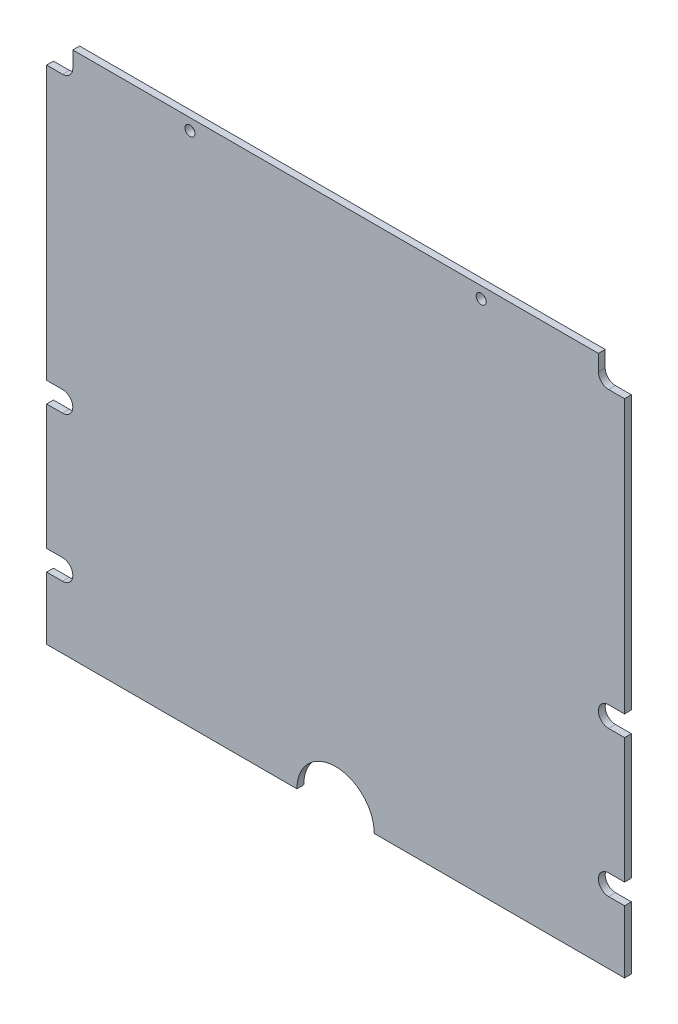
ISO-10303-21;
HEADER;
FILE_DESCRIPTION(('STEP AP214'),'2;1');
FILE_NAME('part.step','',(''),(''),'','','');
FILE_SCHEMA(('AUTOMOTIVE_DESIGN { 1 0 10303 214 1 1 1 1 }'));
ENDSEC;
DATA;
#1=APPLICATION_CONTEXT('core data for automotive mechanical design processes');
#2=APPLICATION_PROTOCOL_DEFINITION('international standard','automotive_design',2000,#1);
#3=PRODUCT_CONTEXT('',#1,'mechanical');
#4=PRODUCT('Part','Part','',(#3));
#5=PRODUCT_RELATED_PRODUCT_CATEGORY('part','',(#4));
#6=PRODUCT_DEFINITION_FORMATION('','',#4);
#7=PRODUCT_DEFINITION_CONTEXT('part definition',#1,'design');
#8=PRODUCT_DEFINITION('design','',#6,#7);
#9=PRODUCT_DEFINITION_SHAPE('','',#8);
#10=(LENGTH_UNIT() NAMED_UNIT(*) SI_UNIT(.MILLI.,.METRE.));
#11=(NAMED_UNIT(*) PLANE_ANGLE_UNIT() SI_UNIT($,.RADIAN.));
#12=(NAMED_UNIT(*) SI_UNIT($,.STERADIAN.) SOLID_ANGLE_UNIT());
#13=UNCERTAINTY_MEASURE_WITH_UNIT(LENGTH_MEASURE(1.E-05),#10,'distance_accuracy_value','');
#14=(GEOMETRIC_REPRESENTATION_CONTEXT(3) GLOBAL_UNCERTAINTY_ASSIGNED_CONTEXT((#13)) GLOBAL_UNIT_ASSIGNED_CONTEXT((#10,
#11,#12)) REPRESENTATION_CONTEXT('',''));
#15=CARTESIAN_POINT('',(0.,0.,0.));
#16=DIRECTION('',(0.,0.,1.));
#17=DIRECTION('',(1.,0.,0.));
#18=AXIS2_PLACEMENT_3D('',#15,#16,#17);
#19=CARTESIAN_POINT('',(-120.,61.,0.));
#20=DIRECTION('',(0.,0.,-1.));
#21=DIRECTION('',(1.,0.,0.));
#22=AXIS2_PLACEMENT_3D('',#19,#20,#21);
#23=CYLINDRICAL_SURFACE('',#22,4.5);
#24=DIRECTION('',(0.,0.,1.));
#25=VECTOR('',#24,1.);
#26=CARTESIAN_POINT('',(-120.000000000003,56.5000000000793,0.));
#27=LINE('',#26,#25);
#28=CARTESIAN_POINT('',(-120.,56.5,0.));
#29=VERTEX_POINT('',#28);
#30=CARTESIAN_POINT('',(-120.,56.5,3.));
#31=VERTEX_POINT('',#30);
#32=EDGE_CURVE('E379',#29,#31,#27,.T.);
#33=ORIENTED_EDGE('',*,*,#32,.T.);
#34=CARTESIAN_POINT('',(-120.,61.,3.));
#35=DIRECTION('',(0.,0.,1.));
#36=DIRECTION('',(1.,0.,0.));
#37=AXIS2_PLACEMENT_3D('',#34,#35,#36);
#38=CIRCLE('',#37,4.5);
#39=CARTESIAN_POINT('',(-115.5,61.000000000001,3.));
#40=VERTEX_POINT('',#39);
#41=EDGE_CURVE('E293',#31,#40,#38,.T.);
#42=ORIENTED_EDGE('',*,*,#41,.T.);
#43=DIRECTION('',(0.,0.,1.));
#44=VECTOR('',#43,1.);
#45=CARTESIAN_POINT('',(-115.5,61.000000000001,0.));
#46=LINE('',#45,#44);
#47=CARTESIAN_POINT('',(-115.5,61.000000000001,0.));
#48=VERTEX_POINT('',#47);
#49=EDGE_CURVE('E11',#48,#40,#46,.T.);
#50=ORIENTED_EDGE('',*,*,#49,.F.);
#51=CARTESIAN_POINT('',(-120.,61.,0.));
#52=DIRECTION('',(0.,0.,1.));
#53=DIRECTION('',(1.,0.,0.));
#54=AXIS2_PLACEMENT_3D('',#51,#52,#53);
#55=CIRCLE('',#54,4.5);
#56=EDGE_CURVE('E300',#29,#48,#55,.T.);
#57=ORIENTED_EDGE('',*,*,#56,.F.);
#58=EDGE_LOOP('',(#33,#42,#50,#57));
#59=FACE_BOUND('',#58,.T.);
#60=ADVANCED_FACE('F17',(#59),#23,.F.);
#61=CARTESIAN_POINT('',(-115.5,61.000000000001,0.));
#62=DIRECTION('',(-1.,0.,0.));
#63=DIRECTION('',(0.,0.,1.));
#64=AXIS2_PLACEMENT_3D('',#61,#62,#63);
#65=PLANE('',#64);
#66=ORIENTED_EDGE('',*,*,#49,.T.);
#67=DIRECTION('',(0.,1.,0.));
#68=VECTOR('',#67,1.);
#69=CARTESIAN_POINT('',(-115.5,61.000000000001,3.));
#70=LINE('',#69,#68);
#71=CARTESIAN_POINT('',(-115.5,68.,3.));
#72=VERTEX_POINT('',#71);
#73=EDGE_CURVE('E289',#40,#72,#70,.T.);
#74=ORIENTED_EDGE('',*,*,#73,.T.);
#75=DIRECTION('',(0.,0.,1.));
#76=VECTOR('',#75,1.);
#77=CARTESIAN_POINT('',(-115.5,68.,0.));
#78=LINE('',#77,#76);
#79=CARTESIAN_POINT('',(-115.5,68.,0.));
#80=VERTEX_POINT('',#79);
#81=EDGE_CURVE('E26',#80,#72,#78,.T.);
#82=ORIENTED_EDGE('',*,*,#81,.F.);
#83=DIRECTION('',(0.,1.,0.));
#84=VECTOR('',#83,1.);
#85=CARTESIAN_POINT('',(-115.5,61.000000000001,0.));
#86=LINE('',#85,#84);
#87=EDGE_CURVE('E314',#48,#80,#86,.T.);
#88=ORIENTED_EDGE('',*,*,#87,.F.);
#89=EDGE_LOOP('',(#66,#74,#82,#88));
#90=FACE_BOUND('',#89,.T.);
#91=ADVANCED_FACE('F470',(#90),#65,.T.);
#92=CARTESIAN_POINT('',(-115.5,68.,0.));
#93=DIRECTION('',(0.,1.,0.));
#94=DIRECTION('',(1.,0.,0.));
#95=AXIS2_PLACEMENT_3D('',#92,#93,#94);
#96=PLANE('',#95);
#97=ORIENTED_EDGE('',*,*,#81,.T.);
#98=DIRECTION('',(1.,0.,0.));
#99=VECTOR('',#98,1.);
#100=CARTESIAN_POINT('',(-115.5,68.,3.));
#101=LINE('',#100,#99);
#102=CARTESIAN_POINT('',(115.5,68.,3.));
#103=VERTEX_POINT('',#102);
#104=EDGE_CURVE('E284',#72,#103,#101,.T.);
#105=ORIENTED_EDGE('',*,*,#104,.T.);
#106=DIRECTION('',(0.,0.,1.));
#107=VECTOR('',#106,1.);
#108=CARTESIAN_POINT('',(115.5,68.,0.));
#109=LINE('',#108,#107);
#110=CARTESIAN_POINT('',(115.5,68.,0.));
#111=VERTEX_POINT('',#110);
#112=EDGE_CURVE('E408',#111,#103,#109,.T.);
#113=ORIENTED_EDGE('',*,*,#112,.F.);
#114=DIRECTION('',(1.,0.,0.));
#115=VECTOR('',#114,1.);
#116=CARTESIAN_POINT('',(-115.5,68.,0.));
#117=LINE('',#116,#115);
#118=EDGE_CURVE('E194',#80,#111,#117,.T.);
#119=ORIENTED_EDGE('',*,*,#118,.F.);
#120=EDGE_LOOP('',(#97,#105,#113,#119));
#121=FACE_BOUND('',#120,.T.);
#122=ADVANCED_FACE('F463',(#121),#96,.T.);
#123=CARTESIAN_POINT('',(115.5,61.000000000002,0.));
#124=DIRECTION('',(-1.,0.,0.));
#125=DIRECTION('',(0.,0.,1.));
#126=AXIS2_PLACEMENT_3D('',#123,#124,#125);
#127=PLANE('',#126);
#128=DIRECTION('',(0.,1.,0.));
#129=VECTOR('',#128,1.);
#130=CARTESIAN_POINT('',(115.5,61.000000000002,0.));
#131=LINE('',#130,#129);
#132=CARTESIAN_POINT('',(115.5,61.000000000002,0.));
#133=VERTEX_POINT('',#132);
#134=EDGE_CURVE('E189',#133,#111,#131,.T.);
#135=ORIENTED_EDGE('',*,*,#134,.T.);
#136=ORIENTED_EDGE('',*,*,#112,.T.);
#137=DIRECTION('',(0.,1.,0.));
#138=VECTOR('',#137,1.);
#139=CARTESIAN_POINT('',(115.5,61.000000000002,3.));
#140=LINE('',#139,#138);
#141=CARTESIAN_POINT('',(115.5,61.000000000002,3.));
#142=VERTEX_POINT('',#141);
#143=EDGE_CURVE('E281',#142,#103,#140,.T.);
#144=ORIENTED_EDGE('',*,*,#143,.F.);
#145=DIRECTION('',(0.,0.,1.));
#146=VECTOR('',#145,1.);
#147=CARTESIAN_POINT('',(115.5,61.000000000002,0.));
#148=LINE('',#147,#146);
#149=EDGE_CURVE('E270',#133,#142,#148,.T.);
#150=ORIENTED_EDGE('',*,*,#149,.F.);
#151=EDGE_LOOP('',(#135,#136,#144,#150));
#152=FACE_BOUND('',#151,.T.);
#153=ADVANCED_FACE('F484',(#152),#127,.F.);
#154=CARTESIAN_POINT('',(120.,61.,0.));
#155=DIRECTION('',(0.,0.,-1.));
#156=DIRECTION('',(1.,0.,0.));
#157=AXIS2_PLACEMENT_3D('',#154,#155,#156);
#158=CYLINDRICAL_SURFACE('',#157,4.5);
#159=ORIENTED_EDGE('',*,*,#149,.T.);
#160=CARTESIAN_POINT('',(120.,61.,3.));
#161=DIRECTION('',(0.,0.,1.));
#162=DIRECTION('',(1.,0.,0.));
#163=AXIS2_PLACEMENT_3D('',#160,#161,#162);
#164=CIRCLE('',#163,4.5);
#165=CARTESIAN_POINT('',(120.,56.5,3.));
#166=VERTEX_POINT('',#165);
#167=EDGE_CURVE('E265',#142,#166,#164,.T.);
#168=ORIENTED_EDGE('',*,*,#167,.T.);
#169=DIRECTION('',(0.,0.,1.));
#170=VECTOR('',#169,1.);
#171=CARTESIAN_POINT('',(120.,56.5,0.));
#172=LINE('',#171,#170);
#173=CARTESIAN_POINT('',(120.,56.5,0.));
#174=VERTEX_POINT('',#173);
#175=EDGE_CURVE('E266',#174,#166,#172,.T.);
#176=ORIENTED_EDGE('',*,*,#175,.F.);
#177=CARTESIAN_POINT('',(120.,61.,0.));
#178=DIRECTION('',(0.,0.,1.));
#179=DIRECTION('',(1.,0.,0.));
#180=AXIS2_PLACEMENT_3D('',#177,#178,#179);
#181=CIRCLE('',#180,4.5);
#182=EDGE_CURVE('E193',#133,#174,#181,.T.);
#183=ORIENTED_EDGE('',*,*,#182,.F.);
#184=EDGE_LOOP('',(#159,#168,#176,#183));
#185=FACE_BOUND('',#184,.T.);
#186=ADVANCED_FACE('F681',(#185),#158,.F.);
#187=CARTESIAN_POINT('',(120.,56.5,0.));
#188=DIRECTION('',(6.60804744257E-13,1.,0.));
#189=DIRECTION('',(1.,-6.60804744257E-13,0.));
#190=AXIS2_PLACEMENT_3D('',#187,#188,#189);
#191=PLANE('',#190);
#192=ORIENTED_EDGE('',*,*,#175,.T.);
#193=DIRECTION('',(1.,-6.60804744257E-13,0.));
#194=VECTOR('',#193,1.);
#195=CARTESIAN_POINT('',(120.,56.5,3.));
#196=LINE('',#195,#194);
#197=CARTESIAN_POINT('',(127.,56.499999999995,3.));
#198=VERTEX_POINT('',#197);
#199=EDGE_CURVE('E261',#166,#198,#196,.T.);
#200=ORIENTED_EDGE('',*,*,#199,.T.);
#201=DIRECTION('',(0.,0.,1.));
#202=VECTOR('',#201,1.);
#203=CARTESIAN_POINT('',(127.,56.499999999995,0.));
#204=LINE('',#203,#202);
#205=CARTESIAN_POINT('',(127.,56.499999999995,0.));
#206=VERTEX_POINT('',#205);
#207=EDGE_CURVE('E271',#206,#198,#204,.T.);
#208=ORIENTED_EDGE('',*,*,#207,.F.);
#209=DIRECTION('',(1.,-6.60804744257E-13,0.));
#210=VECTOR('',#209,1.);
#211=CARTESIAN_POINT('',(120.,56.5,0.));
#212=LINE('',#211,#210);
#213=EDGE_CURVE('E329',#174,#206,#212,.T.);
#214=ORIENTED_EDGE('',*,*,#213,.F.);
#215=EDGE_LOOP('',(#192,#200,#208,#214));
#216=FACE_BOUND('',#215,.T.);
#217=ADVANCED_FACE('F679',(#216),#191,.T.);
#218=CARTESIAN_POINT('',(127.,56.499999999995,0.));
#219=DIRECTION('',(1.,0.,0.));
#220=DIRECTION('',(0.,1.,0.));
#221=AXIS2_PLACEMENT_3D('',#218,#219,#220);
#222=PLANE('',#221);
#223=ORIENTED_EDGE('',*,*,#207,.T.);
#224=DIRECTION('',(0.,-1.,0.));
#225=VECTOR('',#224,1.);
#226=CARTESIAN_POINT('',(127.,56.499999999995,3.));
#227=LINE('',#226,#225);
#228=CARTESIAN_POINT('',(127.,-63.5,3.));
#229=VERTEX_POINT('',#228);
#230=EDGE_CURVE('E227',#198,#229,#227,.T.);
#231=ORIENTED_EDGE('',*,*,#230,.T.);
#232=DIRECTION('',(0.,0.,1.));
#233=VECTOR('',#232,1.);
#234=CARTESIAN_POINT('',(127.,-63.5,0.));
#235=LINE('',#234,#233);
#236=CARTESIAN_POINT('',(127.,-63.5,0.));
#237=VERTEX_POINT('',#236);
#238=EDGE_CURVE('E391',#237,#229,#235,.T.);
#239=ORIENTED_EDGE('',*,*,#238,.F.);
#240=DIRECTION('',(0.,-1.,0.));
#241=VECTOR('',#240,1.);
#242=CARTESIAN_POINT('',(127.,56.499999999995,0.));
#243=LINE('',#242,#241);
#244=EDGE_CURVE('E333',#206,#237,#243,.T.);
#245=ORIENTED_EDGE('',*,*,#244,.F.);
#246=EDGE_LOOP('',(#223,#231,#239,#245));
#247=FACE_BOUND('',#246,.T.);
#248=ADVANCED_FACE('F677',(#247),#222,.T.);
#249=CARTESIAN_POINT('',(120.,-63.5,0.));
#250=DIRECTION('',(0.,1.,0.));
#251=DIRECTION('',(1.,0.,0.));
#252=AXIS2_PLACEMENT_3D('',#249,#250,#251);
#253=PLANE('',#252);
#254=DIRECTION('',(1.,0.,0.));
#255=VECTOR('',#254,1.);
#256=CARTESIAN_POINT('',(120.,-63.5,0.));
#257=LINE('',#256,#255);
#258=CARTESIAN_POINT('',(120.,-63.5,0.));
#259=VERTEX_POINT('',#258);
#260=EDGE_CURVE('E337',#259,#237,#257,.T.);
#261=ORIENTED_EDGE('',*,*,#260,.T.);
#262=ORIENTED_EDGE('',*,*,#238,.T.);
#263=DIRECTION('',(1.,0.,0.));
#264=VECTOR('',#263,1.);
#265=CARTESIAN_POINT('',(120.,-63.5,3.));
#266=LINE('',#265,#264);
#267=CARTESIAN_POINT('',(120.,-63.5,3.));
#268=VERTEX_POINT('',#267);
#269=EDGE_CURVE('E223',#268,#229,#266,.T.);
#270=ORIENTED_EDGE('',*,*,#269,.F.);
#271=DIRECTION('',(0.,0.,1.));
#272=VECTOR('',#271,1.);
#273=CARTESIAN_POINT('',(120.,-63.5,0.));
#274=LINE('',#273,#272);
#275=EDGE_CURVE('E387',#259,#268,#274,.T.);
#276=ORIENTED_EDGE('',*,*,#275,.F.);
#277=EDGE_LOOP('',(#261,#262,#270,#276));
#278=FACE_BOUND('',#277,.T.);
#279=ADVANCED_FACE('F674',(#278),#253,.F.);
#280=CARTESIAN_POINT('',(120.,-68.,0.));
#281=DIRECTION('',(0.,0.,-1.));
#282=DIRECTION('',(1.,0.,0.));
#283=AXIS2_PLACEMENT_3D('',#280,#281,#282);
#284=CYLINDRICAL_SURFACE('',#283,4.5);
#285=ORIENTED_EDGE('',*,*,#275,.T.);
#286=CARTESIAN_POINT('',(120.,-68.,3.));
#287=DIRECTION('',(0.,0.,1.));
#288=DIRECTION('',(1.,0.,0.));
#289=AXIS2_PLACEMENT_3D('',#286,#287,#288);
#290=CIRCLE('',#289,4.5);
#291=CARTESIAN_POINT('',(120.,-72.5,3.));
#292=VERTEX_POINT('',#291);
#293=EDGE_CURVE('E228',#268,#292,#290,.T.);
#294=ORIENTED_EDGE('',*,*,#293,.T.);
#295=DIRECTION('',(0.,0.,1.));
#296=VECTOR('',#295,1.);
#297=CARTESIAN_POINT('',(120.,-72.5,0.));
#298=LINE('',#297,#296);
#299=CARTESIAN_POINT('',(120.,-72.5,0.));
#300=VERTEX_POINT('',#299);
#301=EDGE_CURVE('E392',#300,#292,#298,.T.);
#302=ORIENTED_EDGE('',*,*,#301,.F.);
#303=CARTESIAN_POINT('',(120.,-68.,0.));
#304=DIRECTION('',(0.,0.,1.));
#305=DIRECTION('',(1.,0.,0.));
#306=AXIS2_PLACEMENT_3D('',#303,#304,#305);
#307=CIRCLE('',#306,4.5);
#308=EDGE_CURVE('E341',#259,#300,#307,.T.);
#309=ORIENTED_EDGE('',*,*,#308,.F.);
#310=EDGE_LOOP('',(#285,#294,#302,#309));
#311=FACE_BOUND('',#310,.T.);
#312=ADVANCED_FACE('F670',(#311),#284,.F.);
#313=CARTESIAN_POINT('',(120.,-72.5,0.));
#314=DIRECTION('',(0.,1.,0.));
#315=DIRECTION('',(1.,0.,0.));
#316=AXIS2_PLACEMENT_3D('',#313,#314,#315);
#317=PLANE('',#316);
#318=ORIENTED_EDGE('',*,*,#301,.T.);
#319=DIRECTION('',(1.,0.,0.));
#320=VECTOR('',#319,1.);
#321=CARTESIAN_POINT('',(120.,-72.5,3.));
#322=LINE('',#321,#320);
#323=CARTESIAN_POINT('',(127.,-72.5,3.));
#324=VERTEX_POINT('',#323);
#325=EDGE_CURVE('E245',#292,#324,#322,.T.);
#326=ORIENTED_EDGE('',*,*,#325,.T.);
#327=DIRECTION('',(0.,0.,1.));
#328=VECTOR('',#327,1.);
#329=CARTESIAN_POINT('',(127.,-72.5,0.));
#330=LINE('',#329,#328);
#331=CARTESIAN_POINT('',(127.,-72.5,0.));
#332=VERTEX_POINT('',#331);
#333=EDGE_CURVE('E276',#332,#324,#330,.T.);
#334=ORIENTED_EDGE('',*,*,#333,.F.);
#335=DIRECTION('',(1.,0.,0.));
#336=VECTOR('',#335,1.);
#337=CARTESIAN_POINT('',(120.,-72.5,0.));
#338=LINE('',#337,#336);
#339=EDGE_CURVE('E345',#300,#332,#338,.T.);
#340=ORIENTED_EDGE('',*,*,#339,.F.);
#341=EDGE_LOOP('',(#318,#326,#334,#340));
#342=FACE_BOUND('',#341,.T.);
#343=ADVANCED_FACE('F665',(#342),#317,.T.);
#344=CARTESIAN_POINT('',(127.,56.499999999995,0.));
#345=DIRECTION('',(1.,0.,0.));
#346=DIRECTION('',(0.,1.,0.));
#347=AXIS2_PLACEMENT_3D('',#344,#345,#346);
#348=PLANE('',#347);
#349=ORIENTED_EDGE('',*,*,#333,.T.);
#350=DIRECTION('',(0.,-1.,0.));
#351=VECTOR('',#350,1.);
#352=CARTESIAN_POINT('',(127.,56.499999999995,3.));
#353=LINE('',#352,#351);
#354=CARTESIAN_POINT('',(127.,-127.5,3.));
#355=VERTEX_POINT('',#354);
#356=EDGE_CURVE('E241',#324,#355,#353,.T.);
#357=ORIENTED_EDGE('',*,*,#356,.T.);
#358=DIRECTION('',(0.,0.,1.));
#359=VECTOR('',#358,1.);
#360=CARTESIAN_POINT('',(127.,-127.5,0.));
#361=LINE('',#360,#359);
#362=CARTESIAN_POINT('',(127.,-127.5,0.));
#363=VERTEX_POINT('',#362);
#364=EDGE_CURVE('E272',#363,#355,#361,.T.);
#365=ORIENTED_EDGE('',*,*,#364,.F.);
#366=DIRECTION('',(0.,-1.,0.));
#367=VECTOR('',#366,1.);
#368=CARTESIAN_POINT('',(127.,-51.20112014118,0.));
#369=LINE('',#368,#367);
#370=EDGE_CURVE('E325',#332,#363,#369,.T.);
#371=ORIENTED_EDGE('',*,*,#370,.F.);
#372=EDGE_LOOP('',(#349,#357,#365,#371));
#373=FACE_BOUND('',#372,.T.);
#374=ADVANCED_FACE('F662',(#373),#348,.T.);
#375=CARTESIAN_POINT('',(120.,-127.5,0.));
#376=DIRECTION('',(0.,1.,0.));
#377=DIRECTION('',(1.,0.,0.));
#378=AXIS2_PLACEMENT_3D('',#375,#376,#377);
#379=PLANE('',#378);
#380=DIRECTION('',(1.,0.,0.));
#381=VECTOR('',#380,1.);
#382=CARTESIAN_POINT('',(120.,-127.5,0.));
#383=LINE('',#382,#381);
#384=CARTESIAN_POINT('',(120.,-127.5,0.));
#385=VERTEX_POINT('',#384);
#386=EDGE_CURVE('E321',#385,#363,#383,.T.);
#387=ORIENTED_EDGE('',*,*,#386,.T.);
#388=ORIENTED_EDGE('',*,*,#364,.T.);
#389=DIRECTION('',(1.,0.,0.));
#390=VECTOR('',#389,1.);
#391=CARTESIAN_POINT('',(120.,-127.5,3.));
#392=LINE('',#391,#390);
#393=CARTESIAN_POINT('',(120.,-127.5,3.));
#394=VERTEX_POINT('',#393);
#395=EDGE_CURVE('E240',#394,#355,#392,.T.);
#396=ORIENTED_EDGE('',*,*,#395,.F.);
#397=DIRECTION('',(0.,0.,1.));
#398=VECTOR('',#397,1.);
#399=CARTESIAN_POINT('',(120.,-127.5,0.));
#400=LINE('',#399,#398);
#401=EDGE_CURVE('E277',#385,#394,#400,.T.);
#402=ORIENTED_EDGE('',*,*,#401,.F.);
#403=EDGE_LOOP('',(#387,#388,#396,#402));
#404=FACE_BOUND('',#403,.T.);
#405=ADVANCED_FACE('F658',(#404),#379,.F.);
#406=CARTESIAN_POINT('',(120.,-132.,0.));
#407=DIRECTION('',(0.,0.,-1.));
#408=DIRECTION('',(1.,0.,0.));
#409=AXIS2_PLACEMENT_3D('',#406,#407,#408);
#410=CYLINDRICAL_SURFACE('',#409,4.5);
#411=ORIENTED_EDGE('',*,*,#401,.T.);
#412=CARTESIAN_POINT('',(120.,-132.,3.));
#413=DIRECTION('',(0.,0.,1.));
#414=DIRECTION('',(1.,0.,0.));
#415=AXIS2_PLACEMENT_3D('',#412,#413,#414);
#416=CIRCLE('',#415,4.5);
#417=CARTESIAN_POINT('',(120.,-136.5,3.));
#418=VERTEX_POINT('',#417);
#419=EDGE_CURVE('E236',#394,#418,#416,.T.);
#420=ORIENTED_EDGE('',*,*,#419,.T.);
#421=DIRECTION('',(0.,0.,1.));
#422=VECTOR('',#421,1.);
#423=CARTESIAN_POINT('',(120.,-136.5,0.));
#424=LINE('',#423,#422);
#425=CARTESIAN_POINT('',(120.,-136.5,0.));
#426=VERTEX_POINT('',#425);
#427=EDGE_CURVE('E250',#426,#418,#424,.T.);
#428=ORIENTED_EDGE('',*,*,#427,.F.);
#429=CARTESIAN_POINT('',(120.,-132.,0.));
#430=DIRECTION('',(0.,0.,1.));
#431=DIRECTION('',(1.,0.,0.));
#432=AXIS2_PLACEMENT_3D('',#429,#430,#431);
#433=CIRCLE('',#432,4.5);
#434=EDGE_CURVE('E311',#385,#426,#433,.T.);
#435=ORIENTED_EDGE('',*,*,#434,.F.);
#436=EDGE_LOOP('',(#411,#420,#428,#435));
#437=FACE_BOUND('',#436,.T.);
#438=ADVANCED_FACE('F653',(#437),#410,.F.);
#439=CARTESIAN_POINT('',(120.,-136.5,0.));
#440=DIRECTION('',(0.,1.,0.));
#441=DIRECTION('',(1.,0.,0.));
#442=AXIS2_PLACEMENT_3D('',#439,#440,#441);
#443=PLANE('',#442);
#444=ORIENTED_EDGE('',*,*,#427,.T.);
#445=DIRECTION('',(1.,0.,0.));
#446=VECTOR('',#445,1.);
#447=CARTESIAN_POINT('',(120.,-136.5,3.));
#448=LINE('',#447,#446);
#449=CARTESIAN_POINT('',(127.,-136.5,3.));
#450=VERTEX_POINT('',#449);
#451=EDGE_CURVE('E205',#418,#450,#448,.T.);
#452=ORIENTED_EDGE('',*,*,#451,.T.);
#453=DIRECTION('',(0.,0.,1.));
#454=VECTOR('',#453,1.);
#455=CARTESIAN_POINT('',(127.,-136.5,0.));
#456=LINE('',#455,#454);
#457=CARTESIAN_POINT('',(127.,-136.5,0.));
#458=VERTEX_POINT('',#457);
#459=EDGE_CURVE('E246',#458,#450,#456,.T.);
#460=ORIENTED_EDGE('',*,*,#459,.F.);
#461=DIRECTION('',(1.,0.,0.));
#462=VECTOR('',#461,1.);
#463=CARTESIAN_POINT('',(120.,-136.5,0.));
#464=LINE('',#463,#462);
#465=EDGE_CURVE('E306',#426,#458,#464,.T.);
#466=ORIENTED_EDGE('',*,*,#465,.F.);
#467=EDGE_LOOP('',(#444,#452,#460,#466));
#468=FACE_BOUND('',#467,.T.);
#469=ADVANCED_FACE('F650',(#468),#443,.T.);
#470=CARTESIAN_POINT('',(127.,56.499999999995,0.));
#471=DIRECTION('',(1.,0.,0.));
#472=DIRECTION('',(0.,1.,0.));
#473=AXIS2_PLACEMENT_3D('',#470,#471,#472);
#474=PLANE('',#473);
#475=ORIENTED_EDGE('',*,*,#459,.T.);
#476=DIRECTION('',(0.,-1.,0.));
#477=VECTOR('',#476,1.);
#478=CARTESIAN_POINT('',(127.,56.499999999995,3.));
#479=LINE('',#478,#477);
#480=CARTESIAN_POINT('',(127.,-164.,3.));
#481=VERTEX_POINT('',#480);
#482=EDGE_CURVE('E201',#450,#481,#479,.T.);
#483=ORIENTED_EDGE('',*,*,#482,.T.);
#484=DIRECTION('',(0.,0.,1.));
#485=VECTOR('',#484,1.);
#486=CARTESIAN_POINT('',(127.,-164.,0.));
#487=LINE('',#486,#485);
#488=CARTESIAN_POINT('',(127.,-164.,0.));
#489=VERTEX_POINT('',#488);
#490=EDGE_CURVE('E251',#489,#481,#487,.T.);
#491=ORIENTED_EDGE('',*,*,#490,.F.);
#492=DIRECTION('',(0.,-1.,0.));
#493=VECTOR('',#492,1.);
#494=CARTESIAN_POINT('',(127.,-51.20112014118,0.));
#495=LINE('',#494,#493);
#496=EDGE_CURVE('E310',#458,#489,#495,.T.);
#497=ORIENTED_EDGE('',*,*,#496,.F.);
#498=EDGE_LOOP('',(#475,#483,#491,#497));
#499=FACE_BOUND('',#498,.T.);
#500=ADVANCED_FACE('F647',(#499),#474,.T.);
#501=CARTESIAN_POINT('',(17.,-164.,0.));
#502=DIRECTION('',(0.,1.,0.));
#503=DIRECTION('',(1.,0.,0.));
#504=AXIS2_PLACEMENT_3D('',#501,#502,#503);
#505=PLANE('',#504);
#506=DIRECTION('',(1.,0.,0.));
#507=VECTOR('',#506,1.);
#508=CARTESIAN_POINT('',(17.,-164.,0.));
#509=LINE('',#508,#507);
#510=CARTESIAN_POINT('',(17.,-164.,0.));
#511=VERTEX_POINT('',#510);
#512=EDGE_CURVE('E358',#511,#489,#509,.T.);
#513=ORIENTED_EDGE('',*,*,#512,.T.);
#514=ORIENTED_EDGE('',*,*,#490,.T.);
#515=DIRECTION('',(1.,0.,0.));
#516=VECTOR('',#515,1.);
#517=CARTESIAN_POINT('',(17.,-164.,3.));
#518=LINE('',#517,#516);
#519=CARTESIAN_POINT('',(17.,-164.,3.));
#520=VERTEX_POINT('',#519);
#521=EDGE_CURVE('E206',#520,#481,#518,.T.);
#522=ORIENTED_EDGE('',*,*,#521,.F.);
#523=DIRECTION('',(0.,0.,1.));
#524=VECTOR('',#523,1.);
#525=CARTESIAN_POINT('',(17.,-164.,0.));
#526=LINE('',#525,#524);
#527=EDGE_CURVE('E301',#511,#520,#526,.T.);
#528=ORIENTED_EDGE('',*,*,#527,.F.);
#529=EDGE_LOOP('',(#513,#514,#522,#528));
#530=FACE_BOUND('',#529,.T.);
#531=ADVANCED_FACE('F642',(#530),#505,.F.);
#532=CARTESIAN_POINT('',(0.,-164.,0.));
#533=DIRECTION('',(0.,0.,-1.));
#534=DIRECTION('',(1.,0.,0.));
#535=AXIS2_PLACEMENT_3D('',#532,#533,#534);
#536=CYLINDRICAL_SURFACE('',#535,17.);
#537=ORIENTED_EDGE('',*,*,#527,.T.);
#538=CARTESIAN_POINT('',(0.,-164.,3.));
#539=DIRECTION('',(0.,0.,1.));
#540=DIRECTION('',(1.,0.,0.));
#541=AXIS2_PLACEMENT_3D('',#538,#539,#540);
#542=CIRCLE('',#541,17.);
#543=CARTESIAN_POINT('',(-17.,-164.,3.));
#544=VERTEX_POINT('',#543);
#545=EDGE_CURVE('E232',#520,#544,#542,.T.);
#546=ORIENTED_EDGE('',*,*,#545,.T.);
#547=DIRECTION('',(0.,0.,1.));
#548=VECTOR('',#547,1.);
#549=CARTESIAN_POINT('',(-17.,-164.,0.));
#550=LINE('',#549,#548);
#551=CARTESIAN_POINT('',(-17.,-164.,0.));
#552=VERTEX_POINT('',#551);
#553=EDGE_CURVE('E305',#552,#544,#550,.T.);
#554=ORIENTED_EDGE('',*,*,#553,.F.);
#555=CARTESIAN_POINT('',(0.,-164.,0.));
#556=DIRECTION('',(0.,0.,1.));
#557=DIRECTION('',(1.,0.,0.));
#558=AXIS2_PLACEMENT_3D('',#555,#556,#557);
#559=CIRCLE('',#558,17.);
#560=EDGE_CURVE('E362',#511,#552,#559,.T.);
#561=ORIENTED_EDGE('',*,*,#560,.F.);
#562=EDGE_LOOP('',(#537,#546,#554,#561));
#563=FACE_BOUND('',#562,.T.);
#564=ADVANCED_FACE('F631',(#563),#536,.F.);
#565=CARTESIAN_POINT('',(17.,-164.,0.));
#566=DIRECTION('',(0.,1.,0.));
#567=DIRECTION('',(1.,0.,0.));
#568=AXIS2_PLACEMENT_3D('',#565,#566,#567);
#569=PLANE('',#568);
#570=ORIENTED_EDGE('',*,*,#553,.T.);
#571=DIRECTION('',(-1.,0.,0.));
#572=VECTOR('',#571,1.);
#573=CARTESIAN_POINT('',(17.,-164.,3.));
#574=LINE('',#573,#572);
#575=CARTESIAN_POINT('',(-127.,-164.,3.));
#576=VERTEX_POINT('',#575);
#577=EDGE_CURVE('E222',#544,#576,#574,.T.);
#578=ORIENTED_EDGE('',*,*,#577,.T.);
#579=DIRECTION('',(0.,0.,1.));
#580=VECTOR('',#579,1.);
#581=CARTESIAN_POINT('',(-127.,-164.,0.));
#582=LINE('',#581,#580);
#583=CARTESIAN_POINT('',(-127.,-164.,0.));
#584=VERTEX_POINT('',#583);
#585=EDGE_CURVE('E429',#584,#576,#582,.T.);
#586=ORIENTED_EDGE('',*,*,#585,.F.);
#587=DIRECTION('',(-1.,0.,0.));
#588=VECTOR('',#587,1.);
#589=CARTESIAN_POINT('',(-5.36033724092E-13,-164.,0.));
#590=LINE('',#589,#588);
#591=EDGE_CURVE('E366',#552,#584,#590,.T.);
#592=ORIENTED_EDGE('',*,*,#591,.F.);
#593=EDGE_LOOP('',(#570,#578,#586,#592));
#594=FACE_BOUND('',#593,.T.);
#595=ADVANCED_FACE('F637',(#594),#569,.F.);
#596=CARTESIAN_POINT('',(-127.,-164.,0.));
#597=DIRECTION('',(-1.,0.,0.));
#598=DIRECTION('',(0.,0.,1.));
#599=AXIS2_PLACEMENT_3D('',#596,#597,#598);
#600=PLANE('',#599);
#601=ORIENTED_EDGE('',*,*,#585,.T.);
#602=DIRECTION('',(0.,1.,0.));
#603=VECTOR('',#602,1.);
#604=CARTESIAN_POINT('',(-127.,-164.,3.));
#605=LINE('',#604,#603);
#606=CARTESIAN_POINT('',(-127.,-136.5,3.));
#607=VERTEX_POINT('',#606);
#608=EDGE_CURVE('E218',#576,#607,#605,.T.);
#609=ORIENTED_EDGE('',*,*,#608,.T.);
#610=DIRECTION('',(0.,0.,1.));
#611=VECTOR('',#610,1.);
#612=CARTESIAN_POINT('',(-127.,-136.5,0.));
#613=LINE('',#612,#611);
#614=CARTESIAN_POINT('',(-127.,-136.5,0.));
#615=VERTEX_POINT('',#614);
#616=EDGE_CURVE('E425',#615,#607,#613,.T.);
#617=ORIENTED_EDGE('',*,*,#616,.F.);
#618=DIRECTION('',(0.,1.,0.));
#619=VECTOR('',#618,1.);
#620=CARTESIAN_POINT('',(-127.,-164.,0.));
#621=LINE('',#620,#619);
#622=EDGE_CURVE('E370',#584,#615,#621,.T.);
#623=ORIENTED_EDGE('',*,*,#622,.F.);
#624=EDGE_LOOP('',(#601,#609,#617,#623));
#625=FACE_BOUND('',#624,.T.);
#626=ADVANCED_FACE('F725',(#625),#600,.T.);
#627=CARTESIAN_POINT('',(120.,-136.5,0.));
#628=DIRECTION('',(0.,1.,0.));
#629=DIRECTION('',(1.,0.,0.));
#630=AXIS2_PLACEMENT_3D('',#627,#628,#629);
#631=PLANE('',#630);
#632=DIRECTION('',(-1.,0.,0.));
#633=VECTOR('',#632,1.);
#634=CARTESIAN_POINT('',(120.,-136.5,0.));
#635=LINE('',#634,#633);
#636=CARTESIAN_POINT('',(-120.,-136.5,0.));
#637=VERTEX_POINT('',#636);
#638=EDGE_CURVE('E374',#637,#615,#635,.T.);
#639=ORIENTED_EDGE('',*,*,#638,.T.);
#640=ORIENTED_EDGE('',*,*,#616,.T.);
#641=DIRECTION('',(-1.,0.,0.));
#642=VECTOR('',#641,1.);
#643=CARTESIAN_POINT('',(-5.36033724092E-13,-136.5,3.));
#644=LINE('',#643,#642);
#645=CARTESIAN_POINT('',(-120.,-136.5,3.));
#646=VERTEX_POINT('',#645);
#647=EDGE_CURVE('E214',#646,#607,#644,.T.);
#648=ORIENTED_EDGE('',*,*,#647,.F.);
#649=DIRECTION('',(0.,0.,1.));
#650=VECTOR('',#649,1.);
#651=CARTESIAN_POINT('',(-120.,-136.5,0.));
#652=LINE('',#651,#650);
#653=EDGE_CURVE('E421',#637,#646,#652,.T.);
#654=ORIENTED_EDGE('',*,*,#653,.F.);
#655=EDGE_LOOP('',(#639,#640,#648,#654));
#656=FACE_BOUND('',#655,.T.);
#657=ADVANCED_FACE('F723',(#656),#631,.T.);
#658=CARTESIAN_POINT('',(-120.,-132.,0.));
#659=DIRECTION('',(0.,0.,-1.));
#660=DIRECTION('',(1.,0.,0.));
#661=AXIS2_PLACEMENT_3D('',#658,#659,#660);
#662=CYLINDRICAL_SURFACE('',#661,4.5);
#663=ORIENTED_EDGE('',*,*,#653,.T.);
#664=CARTESIAN_POINT('',(-120.,-132.,3.));
#665=DIRECTION('',(0.,0.,1.));
#666=DIRECTION('',(1.,0.,0.));
#667=AXIS2_PLACEMENT_3D('',#664,#665,#666);
#668=CIRCLE('',#667,4.5);
#669=CARTESIAN_POINT('',(-120.,-127.5,3.));
#670=VERTEX_POINT('',#669);
#671=EDGE_CURVE('E199',#646,#670,#668,.T.);
#672=ORIENTED_EDGE('',*,*,#671,.T.);
#673=DIRECTION('',(0.,0.,1.));
#674=VECTOR('',#673,1.);
#675=CARTESIAN_POINT('',(-120.,-127.5,0.));
#676=LINE('',#675,#674);
#677=CARTESIAN_POINT('',(-120.,-127.5,0.));
#678=VERTEX_POINT('',#677);
#679=EDGE_CURVE('E187',#678,#670,#676,.T.);
#680=ORIENTED_EDGE('',*,*,#679,.F.);
#681=CARTESIAN_POINT('',(-120.,-132.,0.));
#682=DIRECTION('',(0.,0.,1.));
#683=DIRECTION('',(1.,0.,0.));
#684=AXIS2_PLACEMENT_3D('',#681,#682,#683);
#685=CIRCLE('',#684,4.5);
#686=EDGE_CURVE('E378',#637,#678,#685,.T.);
#687=ORIENTED_EDGE('',*,*,#686,.F.);
#688=EDGE_LOOP('',(#663,#672,#680,#687));
#689=FACE_BOUND('',#688,.T.);
#690=ADVANCED_FACE('F719',(#689),#662,.F.);
#691=CARTESIAN_POINT('',(120.,-127.5,0.));
#692=DIRECTION('',(0.,1.,0.));
#693=DIRECTION('',(1.,0.,0.));
#694=AXIS2_PLACEMENT_3D('',#691,#692,#693);
#695=PLANE('',#694);
#696=ORIENTED_EDGE('',*,*,#679,.T.);
#697=DIRECTION('',(-1.,0.,0.));
#698=VECTOR('',#697,1.);
#699=CARTESIAN_POINT('',(120.,-127.5,3.));
#700=LINE('',#699,#698);
#701=CARTESIAN_POINT('',(-127.,-127.5,3.));
#702=VERTEX_POINT('',#701);
#703=EDGE_CURVE('E195',#670,#702,#700,.T.);
#704=ORIENTED_EDGE('',*,*,#703,.T.);
#705=DIRECTION('',(0.,0.,1.));
#706=VECTOR('',#705,1.);
#707=CARTESIAN_POINT('',(-127.,-127.5,0.));
#708=LINE('',#707,#706);
#709=CARTESIAN_POINT('',(-127.,-127.5,0.));
#710=VERTEX_POINT('',#709);
#711=EDGE_CURVE('E398',#710,#702,#708,.T.);
#712=ORIENTED_EDGE('',*,*,#711,.F.);
#713=DIRECTION('',(-1.,0.,0.));
#714=VECTOR('',#713,1.);
#715=CARTESIAN_POINT('',(-5.36033724092E-13,-127.5,0.));
#716=LINE('',#715,#714);
#717=EDGE_CURVE('E386',#678,#710,#716,.T.);
#718=ORIENTED_EDGE('',*,*,#717,.F.);
#719=EDGE_LOOP('',(#696,#704,#712,#718));
#720=FACE_BOUND('',#719,.T.);
#721=ADVANCED_FACE('F715',(#720),#695,.F.);
#722=CARTESIAN_POINT('',(-127.,-164.,0.));
#723=DIRECTION('',(-1.,0.,0.));
#724=DIRECTION('',(0.,0.,1.));
#725=AXIS2_PLACEMENT_3D('',#722,#723,#724);
#726=PLANE('',#725);
#727=ORIENTED_EDGE('',*,*,#711,.T.);
#728=DIRECTION('',(0.,1.,0.));
#729=VECTOR('',#728,1.);
#730=CARTESIAN_POINT('',(-127.,-164.,3.));
#731=LINE('',#730,#729);
#732=CARTESIAN_POINT('',(-127.,-72.5,3.));
#733=VERTEX_POINT('',#732);
#734=EDGE_CURVE('E200',#702,#733,#731,.T.);
#735=ORIENTED_EDGE('',*,*,#734,.T.);
#736=DIRECTION('',(0.,0.,1.));
#737=VECTOR('',#736,1.);
#738=CARTESIAN_POINT('',(-127.,-72.5,0.));
#739=LINE('',#738,#737);
#740=CARTESIAN_POINT('',(-127.,-72.5,0.));
#741=VERTEX_POINT('',#740);
#742=EDGE_CURVE('E402',#741,#733,#739,.T.);
#743=ORIENTED_EDGE('',*,*,#742,.F.);
#744=DIRECTION('',(0.,1.,0.));
#745=VECTOR('',#744,1.);
#746=CARTESIAN_POINT('',(-127.,-51.20112014118,0.));
#747=LINE('',#746,#745);
#748=EDGE_CURVE('E183',#710,#741,#747,.T.);
#749=ORIENTED_EDGE('',*,*,#748,.F.);
#750=EDGE_LOOP('',(#727,#735,#743,#749));
#751=FACE_BOUND('',#750,.T.);
#752=ADVANCED_FACE('F712',(#751),#726,.T.);
#753=CARTESIAN_POINT('',(120.,-72.5,0.));
#754=DIRECTION('',(0.,1.,0.));
#755=DIRECTION('',(1.,0.,0.));
#756=AXIS2_PLACEMENT_3D('',#753,#754,#755);
#757=PLANE('',#756);
#758=DIRECTION('',(-1.,0.,0.));
#759=VECTOR('',#758,1.);
#760=CARTESIAN_POINT('',(120.,-72.5,0.));
#761=LINE('',#760,#759);
#762=CARTESIAN_POINT('',(-120.,-72.5,0.));
#763=VERTEX_POINT('',#762);
#764=EDGE_CURVE('E176',#763,#741,#761,.T.);
#765=ORIENTED_EDGE('',*,*,#764,.T.);
#766=ORIENTED_EDGE('',*,*,#742,.T.);
#767=DIRECTION('',(-1.,0.,0.));
#768=VECTOR('',#767,1.);
#769=CARTESIAN_POINT('',(-5.36033724092E-13,-72.5,3.));
#770=LINE('',#769,#768);
#771=CARTESIAN_POINT('',(-120.,-72.5,3.));
#772=VERTEX_POINT('',#771);
#773=EDGE_CURVE('E210',#772,#733,#770,.T.);
#774=ORIENTED_EDGE('',*,*,#773,.F.);
#775=DIRECTION('',(0.,0.,1.));
#776=VECTOR('',#775,1.);
#777=CARTESIAN_POINT('',(-120.,-72.5,0.));
#778=LINE('',#777,#776);
#779=EDGE_CURVE('E159',#763,#772,#778,.T.);
#780=ORIENTED_EDGE('',*,*,#779,.F.);
#781=EDGE_LOOP('',(#765,#766,#774,#780));
#782=FACE_BOUND('',#781,.T.);
#783=ADVANCED_FACE('F709',(#782),#757,.T.);
#784=CARTESIAN_POINT('',(-120.,-68.,0.));
#785=DIRECTION('',(0.,0.,-1.));
#786=DIRECTION('',(1.,0.,0.));
#787=AXIS2_PLACEMENT_3D('',#784,#785,#786);
#788=CYLINDRICAL_SURFACE('',#787,4.5);
#789=ORIENTED_EDGE('',*,*,#779,.T.);
#790=CARTESIAN_POINT('',(-120.,-68.,3.));
#791=DIRECTION('',(0.,0.,1.));
#792=DIRECTION('',(1.,0.,0.));
#793=AXIS2_PLACEMENT_3D('',#790,#791,#792);
#794=CIRCLE('',#793,4.5);
#795=CARTESIAN_POINT('',(-120.,-63.5,3.));
#796=VERTEX_POINT('',#795);
#797=EDGE_CURVE('E154',#772,#796,#794,.T.);
#798=ORIENTED_EDGE('',*,*,#797,.T.);
#799=DIRECTION('',(0.,0.,1.));
#800=VECTOR('',#799,1.);
#801=CARTESIAN_POINT('',(-120.,-63.5,0.));
#802=LINE('',#801,#800);
#803=CARTESIAN_POINT('',(-120.,-63.5,0.));
#804=VERTEX_POINT('',#803);
#805=EDGE_CURVE('E145',#804,#796,#802,.T.);
#806=ORIENTED_EDGE('',*,*,#805,.F.);
#807=CARTESIAN_POINT('',(-120.,-68.,0.));
#808=DIRECTION('',(0.,0.,1.));
#809=DIRECTION('',(1.,0.,0.));
#810=AXIS2_PLACEMENT_3D('',#807,#808,#809);
#811=CIRCLE('',#810,4.5);
#812=EDGE_CURVE('E150',#763,#804,#811,.T.);
#813=ORIENTED_EDGE('',*,*,#812,.F.);
#814=EDGE_LOOP('',(#789,#798,#806,#813));
#815=FACE_BOUND('',#814,.T.);
#816=ADVANCED_FACE('F148',(#815),#788,.F.);
#817=CARTESIAN_POINT('',(120.,-63.5,0.));
#818=DIRECTION('',(0.,1.,0.));
#819=DIRECTION('',(1.,0.,0.));
#820=AXIS2_PLACEMENT_3D('',#817,#818,#819);
#821=PLANE('',#820);
#822=ORIENTED_EDGE('',*,*,#805,.T.);
#823=DIRECTION('',(-1.,0.,0.));
#824=VECTOR('',#823,1.);
#825=CARTESIAN_POINT('',(120.,-63.5,3.));
#826=LINE('',#825,#824);
#827=CARTESIAN_POINT('',(-127.,-63.5,3.));
#828=VERTEX_POINT('',#827);
#829=EDGE_CURVE('E604',#796,#828,#826,.T.);
#830=ORIENTED_EDGE('',*,*,#829,.T.);
#831=DIRECTION('',(0.,0.,1.));
#832=VECTOR('',#831,1.);
#833=CARTESIAN_POINT('',(-127.,-63.5,0.));
#834=LINE('',#833,#832);
#835=CARTESIAN_POINT('',(-127.,-63.5,0.));
#836=VERTEX_POINT('',#835);
#837=EDGE_CURVE('E160',#836,#828,#834,.T.);
#838=ORIENTED_EDGE('',*,*,#837,.F.);
#839=DIRECTION('',(-1.,0.,0.));
#840=VECTOR('',#839,1.);
#841=CARTESIAN_POINT('',(-5.36033724092E-13,-63.5,0.));
#842=LINE('',#841,#840);
#843=EDGE_CURVE('E163',#804,#836,#842,.T.);
#844=ORIENTED_EDGE('',*,*,#843,.F.);
#845=EDGE_LOOP('',(#822,#830,#838,#844));
#846=FACE_BOUND('',#845,.T.);
#847=ADVANCED_FACE('F164',(#846),#821,.F.);
#848=CARTESIAN_POINT('',(-127.,-164.,0.));
#849=DIRECTION('',(-1.,0.,0.));
#850=DIRECTION('',(0.,0.,1.));
#851=AXIS2_PLACEMENT_3D('',#848,#849,#850);
#852=PLANE('',#851);
#853=ORIENTED_EDGE('',*,*,#837,.T.);
#854=DIRECTION('',(0.,1.,0.));
#855=VECTOR('',#854,1.);
#856=CARTESIAN_POINT('',(-127.,-164.,3.));
#857=LINE('',#856,#855);
#858=CARTESIAN_POINT('',(-127.,56.5,3.));
#859=VERTEX_POINT('',#858);
#860=EDGE_CURVE('E601',#828,#859,#857,.T.);
#861=ORIENTED_EDGE('',*,*,#860,.T.);
#862=DIRECTION('',(0.,0.,1.));
#863=VECTOR('',#862,1.);
#864=CARTESIAN_POINT('',(-127.,56.5000000001632,0.));
#865=LINE('',#864,#863);
#866=CARTESIAN_POINT('',(-127.,56.5,0.));
#867=VERTEX_POINT('',#866);
#868=EDGE_CURVE('E38',#867,#859,#865,.T.);
#869=ORIENTED_EDGE('',*,*,#868,.F.);
#870=DIRECTION('',(0.,1.,0.));
#871=VECTOR('',#870,1.);
#872=CARTESIAN_POINT('',(-127.,-51.20112014118,0.));
#873=LINE('',#872,#871);
#874=EDGE_CURVE('E169',#836,#867,#873,.T.);
#875=ORIENTED_EDGE('',*,*,#874,.F.);
#876=EDGE_LOOP('',(#853,#861,#869,#875));
#877=FACE_BOUND('',#876,.T.);
#878=ADVANCED_FACE('F704',(#877),#852,.T.);
#879=CARTESIAN_POINT('',(120.,56.5,0.));
#880=DIRECTION('',(6.60804744257E-13,1.,0.));
#881=DIRECTION('',(1.,-6.60804744257E-13,0.));
#882=AXIS2_PLACEMENT_3D('',#879,#880,#881);
#883=PLANE('',#882);
#884=DIRECTION('',(-1.,6.60804744257E-13,0.));
#885=VECTOR('',#884,1.);
#886=CARTESIAN_POINT('',(120.,56.5,0.));
#887=LINE('',#886,#885);
#888=EDGE_CURVE('E397',#29,#867,#887,.T.);
#889=ORIENTED_EDGE('',*,*,#888,.T.);
#890=ORIENTED_EDGE('',*,*,#868,.T.);
#891=DIRECTION('',(-1.,6.60804744257E-13,0.));
#892=VECTOR('',#891,1.);
#893=CARTESIAN_POINT('',(7.06333774270453E-11,56.5000000000793,3.));
#894=LINE('',#893,#892);
#895=EDGE_CURVE('E598',#31,#859,#894,.T.);
#896=ORIENTED_EDGE('',*,*,#895,.F.);
#897=ORIENTED_EDGE('',*,*,#32,.F.);
#898=EDGE_LOOP('',(#889,#890,#896,#897));
#899=FACE_BOUND('',#898,.T.);
#900=ADVANCED_FACE('F703',(#899),#883,.T.);
#901=CARTESIAN_POINT('',(64.,63.,0.));
#902=DIRECTION('',(0.,0.,-1.));
#903=DIRECTION('',(1.,0.,0.));
#904=AXIS2_PLACEMENT_3D('',#901,#902,#903);
#905=CYLINDRICAL_SURFACE('',#904,2.2);
#906=CARTESIAN_POINT('',(64.,63.,0.));
#907=DIRECTION('',(0.,0.,1.));
#908=DIRECTION('',(1.,0.,0.));
#909=AXIS2_PLACEMENT_3D('',#906,#907,#908);
#910=CIRCLE('',#909,2.2);
#911=CARTESIAN_POINT('',(66.2,63.,0.));
#912=VERTEX_POINT('',#911);
#913=EDGE_CURVE('E297',#912,#912,#910,.T.);
#914=ORIENTED_EDGE('',*,*,#913,.F.);
#915=EDGE_LOOP('',(#914));
#916=FACE_BOUND('',#915,.T.);
#917=CARTESIAN_POINT('',(64.,63.,3.));
#918=DIRECTION('',(0.,0.,1.));
#919=DIRECTION('',(1.,0.,0.));
#920=AXIS2_PLACEMENT_3D('',#917,#918,#919);
#921=CIRCLE('',#920,2.2);
#922=CARTESIAN_POINT('',(66.2,63.,3.));
#923=VERTEX_POINT('',#922);
#924=EDGE_CURVE('E593',#923,#923,#921,.T.);
#925=ORIENTED_EDGE('',*,*,#924,.T.);
#926=EDGE_LOOP('',(#925));
#927=FACE_BOUND('',#926,.T.);
#928=ADVANCED_FACE('F740',(#916,#927),#905,.F.);
#929=CARTESIAN_POINT('',(-64.,63.,0.));
#930=DIRECTION('',(0.,0.,-1.));
#931=DIRECTION('',(1.,0.,0.));
#932=AXIS2_PLACEMENT_3D('',#929,#930,#931);
#933=CYLINDRICAL_SURFACE('',#932,2.2);
#934=CARTESIAN_POINT('',(-64.,63.,0.));
#935=DIRECTION('',(0.,0.,1.));
#936=DIRECTION('',(1.,0.,0.));
#937=AXIS2_PLACEMENT_3D('',#934,#935,#936);
#938=CIRCLE('',#937,2.2);
#939=CARTESIAN_POINT('',(-61.8,63.,0.));
#940=VERTEX_POINT('',#939);
#941=EDGE_CURVE('E294',#940,#940,#938,.T.);
#942=ORIENTED_EDGE('',*,*,#941,.F.);
#943=EDGE_LOOP('',(#942));
#944=FACE_BOUND('',#943,.T.);
#945=CARTESIAN_POINT('',(-64.,63.,3.));
#946=DIRECTION('',(0.,0.,1.));
#947=DIRECTION('',(1.,0.,0.));
#948=AXIS2_PLACEMENT_3D('',#945,#946,#947);
#949=CIRCLE('',#948,2.2);
#950=CARTESIAN_POINT('',(-61.8,63.,3.));
#951=VERTEX_POINT('',#950);
#952=EDGE_CURVE('E589',#951,#951,#949,.T.);
#953=ORIENTED_EDGE('',*,*,#952,.T.);
#954=EDGE_LOOP('',(#953));
#955=FACE_BOUND('',#954,.T.);
#956=ADVANCED_FACE('F590',(#944,#955),#933,.F.);
#957=CARTESIAN_POINT('',(-5.36033724092E-13,-51.20112014118,0.));
#958=DIRECTION('',(0.,0.,1.));
#959=DIRECTION('',(1.,0.,0.));
#960=AXIS2_PLACEMENT_3D('',#957,#958,#959);
#961=PLANE('',#960);
#962=ORIENTED_EDGE('',*,*,#56,.T.);
#963=ORIENTED_EDGE('',*,*,#87,.T.);
#964=ORIENTED_EDGE('',*,*,#118,.T.);
#965=ORIENTED_EDGE('',*,*,#134,.F.);
#966=ORIENTED_EDGE('',*,*,#182,.T.);
#967=ORIENTED_EDGE('',*,*,#213,.T.);
#968=ORIENTED_EDGE('',*,*,#244,.T.);
#969=ORIENTED_EDGE('',*,*,#260,.F.);
#970=ORIENTED_EDGE('',*,*,#308,.T.);
#971=ORIENTED_EDGE('',*,*,#339,.T.);
#972=ORIENTED_EDGE('',*,*,#370,.T.);
#973=ORIENTED_EDGE('',*,*,#386,.F.);
#974=ORIENTED_EDGE('',*,*,#434,.T.);
#975=ORIENTED_EDGE('',*,*,#465,.T.);
#976=ORIENTED_EDGE('',*,*,#496,.T.);
#977=ORIENTED_EDGE('',*,*,#512,.F.);
#978=ORIENTED_EDGE('',*,*,#560,.T.);
#979=ORIENTED_EDGE('',*,*,#591,.T.);
#980=ORIENTED_EDGE('',*,*,#622,.T.);
#981=ORIENTED_EDGE('',*,*,#638,.F.);
#982=ORIENTED_EDGE('',*,*,#686,.T.);
#983=ORIENTED_EDGE('',*,*,#717,.T.);
#984=ORIENTED_EDGE('',*,*,#748,.T.);
#985=ORIENTED_EDGE('',*,*,#764,.F.);
#986=ORIENTED_EDGE('',*,*,#812,.T.);
#987=ORIENTED_EDGE('',*,*,#843,.T.);
#988=ORIENTED_EDGE('',*,*,#874,.T.);
#989=ORIENTED_EDGE('',*,*,#888,.F.);
#990=EDGE_LOOP('',(#962,#963,#964,#965,#966,#967,#968,#969,#970,#971,#972,#973,#974,#975,#976,
#977,#978,#979,#980,#981,#982,#983,#984,#985,#986,#987,#988,#989));
#991=FACE_BOUND('',#990,.T.);
#992=ORIENTED_EDGE('',*,*,#913,.T.);
#993=EDGE_LOOP('',(#992));
#994=FACE_BOUND('',#993,.T.);
#995=ORIENTED_EDGE('',*,*,#941,.T.);
#996=EDGE_LOOP('',(#995));
#997=FACE_BOUND('',#996,.T.);
#998=ADVANCED_FACE('F172',(#991,#994,#997),#961,.F.);
#999=CARTESIAN_POINT('',(-5.36033724092E-13,-51.20112014118,3.));
#1000=DIRECTION('',(0.,0.,1.));
#1001=DIRECTION('',(1.,0.,0.));
#1002=AXIS2_PLACEMENT_3D('',#999,#1000,#1001);
#1003=PLANE('',#1002);
#1004=ORIENTED_EDGE('',*,*,#895,.T.);
#1005=ORIENTED_EDGE('',*,*,#860,.F.);
#1006=ORIENTED_EDGE('',*,*,#829,.F.);
#1007=ORIENTED_EDGE('',*,*,#797,.F.);
#1008=ORIENTED_EDGE('',*,*,#773,.T.);
#1009=ORIENTED_EDGE('',*,*,#734,.F.);
#1010=ORIENTED_EDGE('',*,*,#703,.F.);
#1011=ORIENTED_EDGE('',*,*,#671,.F.);
#1012=ORIENTED_EDGE('',*,*,#647,.T.);
#1013=ORIENTED_EDGE('',*,*,#608,.F.);
#1014=ORIENTED_EDGE('',*,*,#577,.F.);
#1015=ORIENTED_EDGE('',*,*,#545,.F.);
#1016=ORIENTED_EDGE('',*,*,#521,.T.);
#1017=ORIENTED_EDGE('',*,*,#482,.F.);
#1018=ORIENTED_EDGE('',*,*,#451,.F.);
#1019=ORIENTED_EDGE('',*,*,#419,.F.);
#1020=ORIENTED_EDGE('',*,*,#395,.T.);
#1021=ORIENTED_EDGE('',*,*,#356,.F.);
#1022=ORIENTED_EDGE('',*,*,#325,.F.);
#1023=ORIENTED_EDGE('',*,*,#293,.F.);
#1024=ORIENTED_EDGE('',*,*,#269,.T.);
#1025=ORIENTED_EDGE('',*,*,#230,.F.);
#1026=ORIENTED_EDGE('',*,*,#199,.F.);
#1027=ORIENTED_EDGE('',*,*,#167,.F.);
#1028=ORIENTED_EDGE('',*,*,#143,.T.);
#1029=ORIENTED_EDGE('',*,*,#104,.F.);
#1030=ORIENTED_EDGE('',*,*,#73,.F.);
#1031=ORIENTED_EDGE('',*,*,#41,.F.);
#1032=EDGE_LOOP('',(#1004,#1005,#1006,#1007,#1008,#1009,#1010,#1011,#1012,#1013,#1014,#1015,
#1016,#1017,#1018,#1019,#1020,#1021,#1022,#1023,#1024,#1025,#1026,#1027,#1028,#1029,#1030,#1031));
#1033=FACE_BOUND('',#1032,.T.);
#1034=ORIENTED_EDGE('',*,*,#924,.F.);
#1035=EDGE_LOOP('',(#1034));
#1036=FACE_BOUND('',#1035,.T.);
#1037=ORIENTED_EDGE('',*,*,#952,.F.);
#1038=EDGE_LOOP('',(#1037));
#1039=FACE_BOUND('',#1038,.T.);
#1040=ADVANCED_FACE('F475',(#1033,#1036,#1039),#1003,.T.);
#1041=CLOSED_SHELL('',(#60,#91,#122,#153,#186,#217,#248,#279,#312,#343,#374,#405,#438,#469,#500,
#531,#564,#595,#626,#657,#690,#721,#752,#783,#816,#847,#878,#900,#928,#956,#998,#1040));
#1042=MANIFOLD_SOLID_BREP('B1',#1041);
#1043=ADVANCED_BREP_SHAPE_REPRESENTATION('',(#18,#1042),#14);
#1044=SHAPE_DEFINITION_REPRESENTATION(#9,#1043);
ENDSEC;
END-ISO-10303-21;
